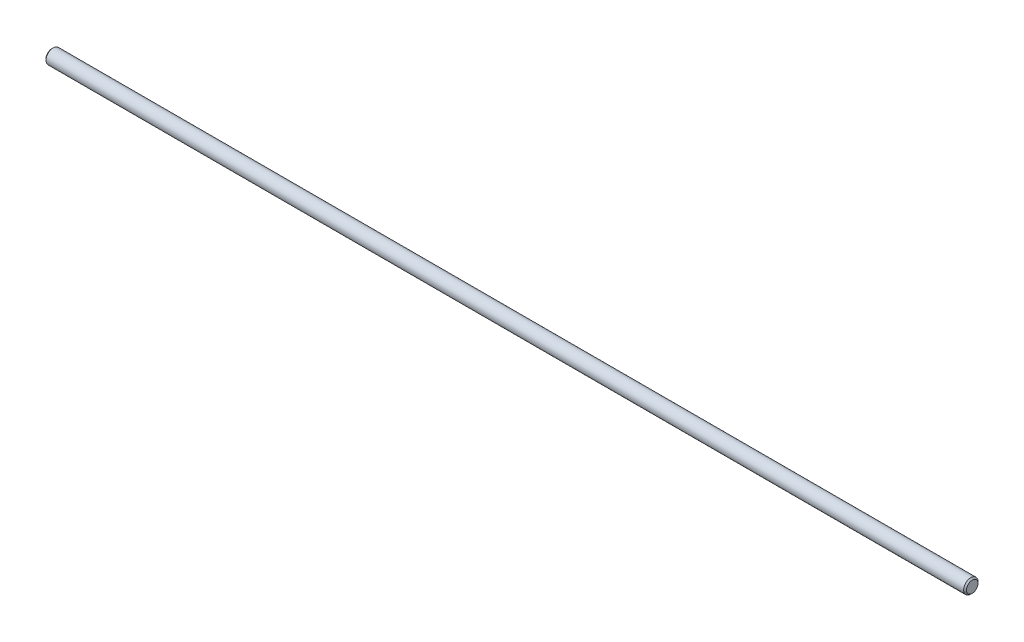
ISO-10303-21;
HEADER;
FILE_DESCRIPTION(('STEP AP214'),'2;1');
FILE_NAME('part.step','',(''),(''),'','','');
FILE_SCHEMA(('AUTOMOTIVE_DESIGN { 1 0 10303 214 1 1 1 1 }'));
ENDSEC;
DATA;
#1=APPLICATION_CONTEXT('core data for automotive mechanical design processes');
#2=APPLICATION_PROTOCOL_DEFINITION('international standard','automotive_design',2000,#1);
#3=PRODUCT_CONTEXT('',#1,'mechanical');
#4=PRODUCT('Part','Part','',(#3));
#5=PRODUCT_RELATED_PRODUCT_CATEGORY('part','',(#4));
#6=PRODUCT_DEFINITION_FORMATION('','',#4);
#7=PRODUCT_DEFINITION_CONTEXT('part definition',#1,'design');
#8=PRODUCT_DEFINITION('design','',#6,#7);
#9=PRODUCT_DEFINITION_SHAPE('','',#8);
#10=(LENGTH_UNIT() NAMED_UNIT(*) SI_UNIT(.MILLI.,.METRE.));
#11=(NAMED_UNIT(*) PLANE_ANGLE_UNIT() SI_UNIT($,.RADIAN.));
#12=(NAMED_UNIT(*) SI_UNIT($,.STERADIAN.) SOLID_ANGLE_UNIT());
#13=UNCERTAINTY_MEASURE_WITH_UNIT(LENGTH_MEASURE(1.E-05),#10,'distance_accuracy_value','');
#14=(GEOMETRIC_REPRESENTATION_CONTEXT(3) GLOBAL_UNCERTAINTY_ASSIGNED_CONTEXT((#13)) GLOBAL_UNIT_ASSIGNED_CONTEXT((#10,
#11,#12)) REPRESENTATION_CONTEXT('',''));
#15=CARTESIAN_POINT('',(0.,0.,0.));
#16=DIRECTION('',(0.,0.,1.));
#17=DIRECTION('',(1.,0.,0.));
#18=AXIS2_PLACEMENT_3D('',#15,#16,#17);
#19=CARTESIAN_POINT('',(-203.2,0.,0.));
#20=DIRECTION('',(1.,0.,0.));
#21=DIRECTION('',(0.,0.,-1.));
#22=AXIS2_PLACEMENT_3D('',#19,#20,#21);
#23=CYLINDRICAL_SURFACE('',#22,3.175);
#24=CARTESIAN_POINT('',(202.565,0.,0.));
#25=DIRECTION('',(1.,0.,0.));
#26=DIRECTION('',(0.,0.,-1.));
#27=AXIS2_PLACEMENT_3D('',#24,#25,#26);
#28=CIRCLE('',#27,3.175);
#29=CARTESIAN_POINT('',(202.565,0.,-3.175));
#30=VERTEX_POINT('',#29);
#31=EDGE_CURVE('E42',#30,#30,#28,.F.);
#32=ORIENTED_EDGE('',*,*,#31,.T.);
#33=EDGE_LOOP('',(#32));
#34=FACE_BOUND('',#33,.T.);
#35=CARTESIAN_POINT('',(-202.565,0.,0.));
#36=DIRECTION('',(1.,0.,0.));
#37=DIRECTION('',(0.,0.,-1.));
#38=AXIS2_PLACEMENT_3D('',#35,#36,#37);
#39=CIRCLE('',#38,3.175);
#40=CARTESIAN_POINT('',(-202.565,0.,-3.175));
#41=VERTEX_POINT('',#40);
#42=EDGE_CURVE('E46',#41,#41,#39,.T.);
#43=ORIENTED_EDGE('',*,*,#42,.T.);
#44=EDGE_LOOP('',(#43));
#45=FACE_BOUND('',#44,.T.);
#46=ADVANCED_FACE('F35',(#34,#45),#23,.T.);
#47=CARTESIAN_POINT('',(-203.2,0.,0.));
#48=DIRECTION('',(1.,0.,0.));
#49=DIRECTION('',(0.,0.,-1.));
#50=AXIS2_PLACEMENT_3D('',#47,#48,#49);
#51=PLANE('',#50);
#52=CARTESIAN_POINT('',(-203.2,0.,0.));
#53=DIRECTION('',(1.,0.,0.));
#54=DIRECTION('',(0.,0.,-1.));
#55=AXIS2_PLACEMENT_3D('',#52,#53,#54);
#56=CIRCLE('',#55,2.53999999999999);
#57=CARTESIAN_POINT('',(-203.2,0.,-2.53999999999999));
#58=VERTEX_POINT('',#57);
#59=EDGE_CURVE('E10',#58,#58,#56,.F.);
#60=ORIENTED_EDGE('',*,*,#59,.T.);
#61=EDGE_LOOP('',(#60));
#62=FACE_BOUND('',#61,.T.);
#63=ADVANCED_FACE('F66',(#62),#51,.F.);
#64=CARTESIAN_POINT('',(203.2,0.,0.));
#65=DIRECTION('',(1.,0.,0.));
#66=DIRECTION('',(0.,0.,-1.));
#67=AXIS2_PLACEMENT_3D('',#64,#65,#66);
#68=PLANE('',#67);
#69=CARTESIAN_POINT('',(203.2,0.,0.));
#70=DIRECTION('',(1.,0.,0.));
#71=DIRECTION('',(0.,0.,-1.));
#72=AXIS2_PLACEMENT_3D('',#69,#70,#71);
#73=CIRCLE('',#72,2.53999999999999);
#74=CARTESIAN_POINT('',(203.2,0.,-2.53999999999999));
#75=VERTEX_POINT('',#74);
#76=EDGE_CURVE('E50',#75,#75,#73,.T.);
#77=ORIENTED_EDGE('',*,*,#76,.T.);
#78=EDGE_LOOP('',(#77));
#79=FACE_BOUND('',#78,.T.);
#80=ADVANCED_FACE('F56',(#79),#68,.T.);
#81=CARTESIAN_POINT('',(203.2,0.,0.));
#82=DIRECTION('',(-1.,0.,0.));
#83=DIRECTION('',(0.,0.,1.));
#84=AXIS2_PLACEMENT_3D('',#81,#82,#83);
#85=CONICAL_SURFACE('',#84,2.53999999999999,0.785398163397418);
#86=ORIENTED_EDGE('',*,*,#31,.F.);
#87=EDGE_LOOP('',(#86));
#88=FACE_BOUND('',#87,.T.);
#89=ORIENTED_EDGE('',*,*,#76,.F.);
#90=EDGE_LOOP('',(#89));
#91=FACE_BOUND('',#90,.T.);
#92=ADVANCED_FACE('F58',(#88,#91),#85,.T.);
#93=CARTESIAN_POINT('',(-202.565,0.,0.));
#94=DIRECTION('',(1.,0.,0.));
#95=DIRECTION('',(0.,0.,-1.));
#96=AXIS2_PLACEMENT_3D('',#93,#94,#95);
#97=CONICAL_SURFACE('',#96,3.175,0.78539816339744);
#98=ORIENTED_EDGE('',*,*,#59,.F.);
#99=EDGE_LOOP('',(#98));
#100=FACE_BOUND('',#99,.T.);
#101=ORIENTED_EDGE('',*,*,#42,.F.);
#102=EDGE_LOOP('',(#101));
#103=FACE_BOUND('',#102,.T.);
#104=ADVANCED_FACE('F37',(#100,#103),#97,.T.);
#105=CLOSED_SHELL('',(#46,#63,#80,#92,#104));
#106=MANIFOLD_SOLID_BREP('B2',#105);
#107=ADVANCED_BREP_SHAPE_REPRESENTATION('',(#18,#106),#14);
#108=SHAPE_DEFINITION_REPRESENTATION(#9,#107);
ENDSEC;
END-ISO-10303-21;
